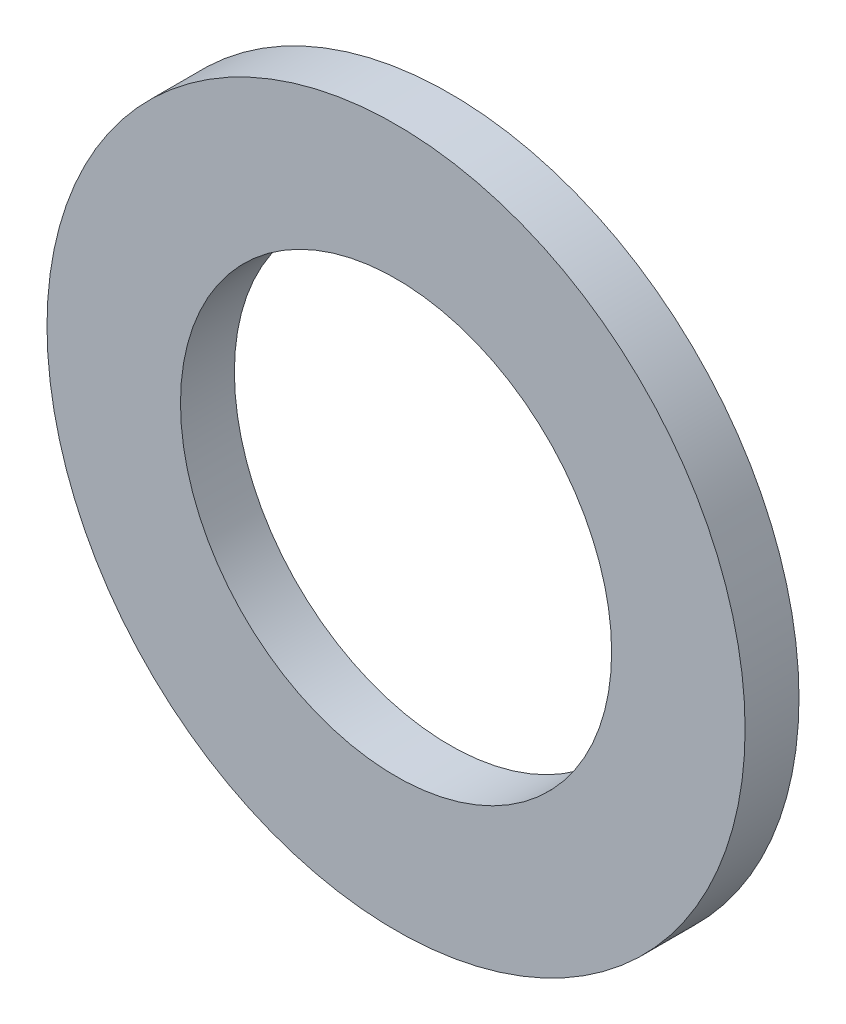
ISO-10303-21;
HEADER;
FILE_DESCRIPTION(('STEP AP214'),'2;1');
FILE_NAME('part.step','',(''),(''),'','','');
FILE_SCHEMA(('AUTOMOTIVE_DESIGN { 1 0 10303 214 1 1 1 1 }'));
ENDSEC;
DATA;
#1=APPLICATION_CONTEXT('core data for automotive mechanical design processes');
#2=APPLICATION_PROTOCOL_DEFINITION('international standard','automotive_design',2000,#1);
#3=PRODUCT_CONTEXT('',#1,'mechanical');
#4=PRODUCT('Part','Part','',(#3));
#5=PRODUCT_RELATED_PRODUCT_CATEGORY('part','',(#4));
#6=PRODUCT_DEFINITION_FORMATION('','',#4);
#7=PRODUCT_DEFINITION_CONTEXT('part definition',#1,'design');
#8=PRODUCT_DEFINITION('design','',#6,#7);
#9=PRODUCT_DEFINITION_SHAPE('','',#8);
#10=(LENGTH_UNIT() NAMED_UNIT(*) SI_UNIT(.MILLI.,.METRE.));
#11=(NAMED_UNIT(*) PLANE_ANGLE_UNIT() SI_UNIT($,.RADIAN.));
#12=(NAMED_UNIT(*) SI_UNIT($,.STERADIAN.) SOLID_ANGLE_UNIT());
#13=UNCERTAINTY_MEASURE_WITH_UNIT(LENGTH_MEASURE(1.E-05),#10,'distance_accuracy_value','');
#14=(GEOMETRIC_REPRESENTATION_CONTEXT(3) GLOBAL_UNCERTAINTY_ASSIGNED_CONTEXT((#13)) GLOBAL_UNIT_ASSIGNED_CONTEXT((#10,
#11,#12)) REPRESENTATION_CONTEXT('',''));
#15=CARTESIAN_POINT('',(0.,0.,0.));
#16=DIRECTION('',(0.,0.,1.));
#17=DIRECTION('',(1.,0.,0.));
#18=AXIS2_PLACEMENT_3D('',#15,#16,#17);
#19=CARTESIAN_POINT('',(-26.0074694451963,-4.9686167072727,5.));
#20=DIRECTION('',(0.,0.,1.));
#21=DIRECTION('',(1.,0.,0.));
#22=AXIS2_PLACEMENT_3D('',#19,#20,#21);
#23=PLANE('',#22);
#24=CARTESIAN_POINT('',(-26.0074694451963,-4.9686167072727,5.));
#25=DIRECTION('',(0.,0.,1.));
#26=DIRECTION('',(1.,0.,0.));
#27=AXIS2_PLACEMENT_3D('',#24,#25,#26);
#28=CIRCLE('',#27,32.3845763996681);
#29=CARTESIAN_POINT('',(6.37710695447176,-4.9686167072727,5.));
#30=VERTEX_POINT('',#29);
#31=EDGE_CURVE('E10',#30,#30,#28,.T.);
#32=ORIENTED_EDGE('',*,*,#31,.T.);
#33=EDGE_LOOP('',(#32));
#34=FACE_BOUND('',#33,.T.);
#35=CARTESIAN_POINT('',(-26.0074694451963,-4.9686167072727,5.));
#36=DIRECTION('',(0.,0.,1.));
#37=DIRECTION('',(1.,0.,0.));
#38=AXIS2_PLACEMENT_3D('',#35,#36,#37);
#39=CIRCLE('',#38,20.);
#40=CARTESIAN_POINT('',(-6.00746944519634,-4.9686167072727,5.));
#41=VERTEX_POINT('',#40);
#42=EDGE_CURVE('E46',#41,#41,#39,.T.);
#43=ORIENTED_EDGE('',*,*,#42,.F.);
#44=EDGE_LOOP('',(#43));
#45=FACE_BOUND('',#44,.T.);
#46=ADVANCED_FACE('F35',(#34,#45),#23,.T.);
#47=CARTESIAN_POINT('',(-26.0074694451963,-4.9686167072727,0.));
#48=DIRECTION('',(0.,0.,1.));
#49=DIRECTION('',(1.,0.,0.));
#50=AXIS2_PLACEMENT_3D('',#47,#48,#49);
#51=PLANE('',#50);
#52=CARTESIAN_POINT('',(-26.0074694451963,-4.9686167072727,0.));
#53=DIRECTION('',(0.,0.,1.));
#54=DIRECTION('',(1.,0.,0.));
#55=AXIS2_PLACEMENT_3D('',#52,#53,#54);
#56=CIRCLE('',#55,32.3845763996681);
#57=CARTESIAN_POINT('',(6.37710695447176,-4.9686167072727,0.));
#58=VERTEX_POINT('',#57);
#59=EDGE_CURVE('E39',#58,#58,#56,.T.);
#60=ORIENTED_EDGE('',*,*,#59,.F.);
#61=EDGE_LOOP('',(#60));
#62=FACE_BOUND('',#61,.T.);
#63=CARTESIAN_POINT('',(-26.0074694451963,-4.9686167072727,0.));
#64=DIRECTION('',(0.,0.,1.));
#65=DIRECTION('',(1.,0.,0.));
#66=AXIS2_PLACEMENT_3D('',#63,#64,#65);
#67=CIRCLE('',#66,20.);
#68=CARTESIAN_POINT('',(-6.00746944519634,-4.9686167072727,0.));
#69=VERTEX_POINT('',#68);
#70=EDGE_CURVE('E48',#69,#69,#67,.T.);
#71=ORIENTED_EDGE('',*,*,#70,.T.);
#72=EDGE_LOOP('',(#71));
#73=FACE_BOUND('',#72,.T.);
#74=ADVANCED_FACE('F58',(#62,#73),#51,.F.);
#75=CARTESIAN_POINT('',(-26.0074694451963,-4.9686167072727,5.));
#76=DIRECTION('',(0.,0.,-1.));
#77=DIRECTION('',(-1.,0.,0.));
#78=AXIS2_PLACEMENT_3D('',#75,#76,#77);
#79=CYLINDRICAL_SURFACE('',#78,32.3845763996681);
#80=ORIENTED_EDGE('',*,*,#31,.F.);
#81=EDGE_LOOP('',(#80));
#82=FACE_BOUND('',#81,.T.);
#83=ORIENTED_EDGE('',*,*,#59,.T.);
#84=EDGE_LOOP('',(#83));
#85=FACE_BOUND('',#84,.T.);
#86=ADVANCED_FACE('F37',(#82,#85),#79,.T.);
#87=CARTESIAN_POINT('',(-26.0074694451963,-4.9686167072727,5.));
#88=DIRECTION('',(0.,0.,-1.));
#89=DIRECTION('',(-1.,0.,0.));
#90=AXIS2_PLACEMENT_3D('',#87,#88,#89);
#91=CYLINDRICAL_SURFACE('',#90,20.);
#92=ORIENTED_EDGE('',*,*,#42,.T.);
#93=EDGE_LOOP('',(#92));
#94=FACE_BOUND('',#93,.T.);
#95=ORIENTED_EDGE('',*,*,#70,.F.);
#96=EDGE_LOOP('',(#95));
#97=FACE_BOUND('',#96,.T.);
#98=ADVANCED_FACE('F54',(#94,#97),#91,.F.);
#99=CLOSED_SHELL('',(#46,#74,#86,#98));
#100=MANIFOLD_SOLID_BREP('B2',#99);
#101=ADVANCED_BREP_SHAPE_REPRESENTATION('',(#18,#100),#14);
#102=SHAPE_DEFINITION_REPRESENTATION(#9,#101);
ENDSEC;
END-ISO-10303-21;
